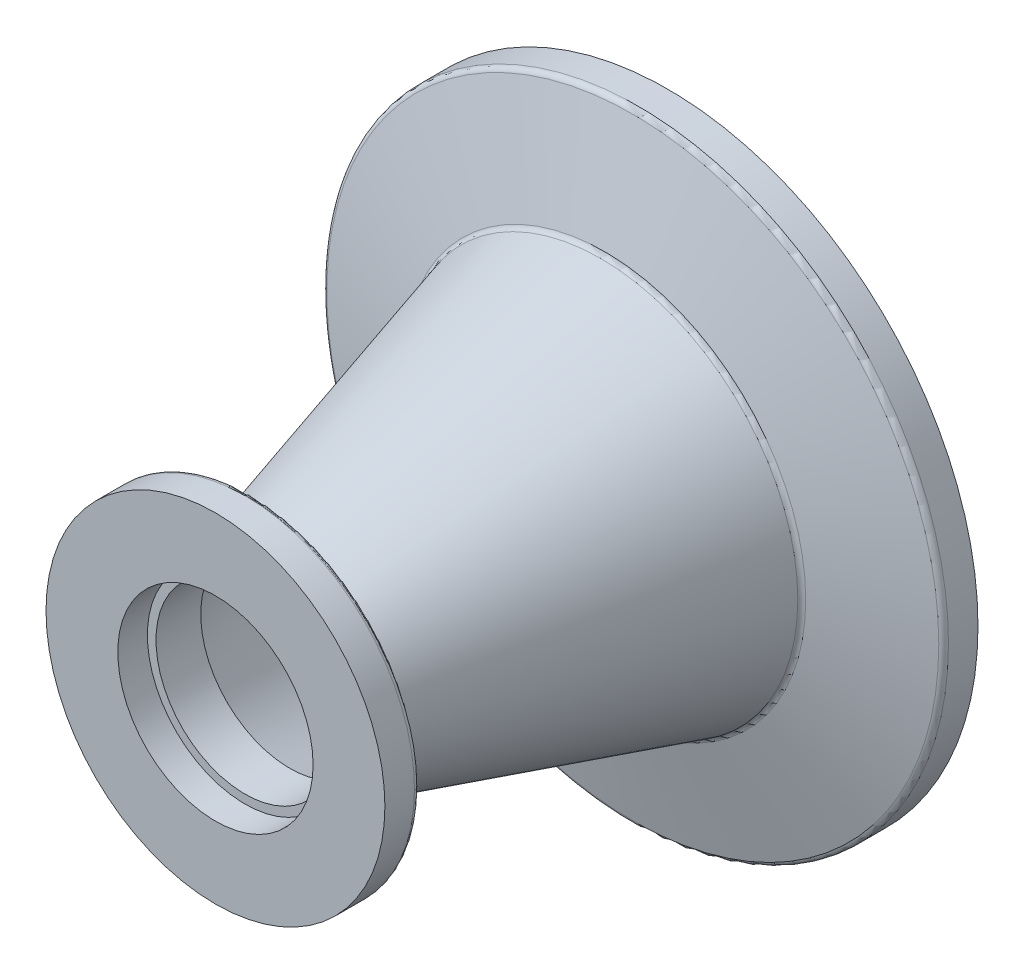
ISO-10303-21;
HEADER;
FILE_DESCRIPTION(('STEP AP214'),'2;1');
FILE_NAME('part.step','',(''),(''),'','','');
FILE_SCHEMA(('AUTOMOTIVE_DESIGN { 1 0 10303 214 1 1 1 1 }'));
ENDSEC;
DATA;
#1=APPLICATION_CONTEXT('core data for automotive mechanical design processes');
#2=APPLICATION_PROTOCOL_DEFINITION('international standard','automotive_design',2000,#1);
#3=PRODUCT_CONTEXT('',#1,'mechanical');
#4=PRODUCT('Part','Part','',(#3));
#5=PRODUCT_RELATED_PRODUCT_CATEGORY('part','',(#4));
#6=PRODUCT_DEFINITION_FORMATION('','',#4);
#7=PRODUCT_DEFINITION_CONTEXT('part definition',#1,'design');
#8=PRODUCT_DEFINITION('design','',#6,#7);
#9=PRODUCT_DEFINITION_SHAPE('','',#8);
#10=(LENGTH_UNIT() NAMED_UNIT(*) SI_UNIT(.MILLI.,.METRE.));
#11=(NAMED_UNIT(*) PLANE_ANGLE_UNIT() SI_UNIT($,.RADIAN.));
#12=(NAMED_UNIT(*) SI_UNIT($,.STERADIAN.) SOLID_ANGLE_UNIT());
#13=UNCERTAINTY_MEASURE_WITH_UNIT(LENGTH_MEASURE(1.E-05),#10,'distance_accuracy_value','');
#14=(GEOMETRIC_REPRESENTATION_CONTEXT(3) GLOBAL_UNCERTAINTY_ASSIGNED_CONTEXT((#13)) GLOBAL_UNIT_ASSIGNED_CONTEXT((#10,
#11,#12)) REPRESENTATION_CONTEXT('',''));
#15=CARTESIAN_POINT('',(0.,0.,0.));
#16=DIRECTION('',(0.,0.,1.));
#17=DIRECTION('',(1.,0.,0.));
#18=AXIS2_PLACEMENT_3D('',#15,#16,#17);
#19=CARTESIAN_POINT('',(0.,20.6502,-20.0025));
#20=DIRECTION('',(0.,0.,1.));
#21=DIRECTION('',(1.,0.,0.));
#22=AXIS2_PLACEMENT_3D('',#19,#20,#21);
#23=PLANE('',#22);
#24=CARTESIAN_POINT('',(0.,0.,-20.0025));
#25=DIRECTION('',(0.,0.,1.));
#26=DIRECTION('',(1.,0.,0.));
#27=AXIS2_PLACEMENT_3D('',#24,#25,#26);
#28=CIRCLE('',#27,27.432);
#29=CARTESIAN_POINT('',(27.432,0.,-20.0025));
#30=VERTEX_POINT('',#29);
#31=EDGE_CURVE('E10',#30,#30,#28,.T.);
#32=ORIENTED_EDGE('',*,*,#31,.F.);
#33=EDGE_LOOP('',(#32));
#34=FACE_BOUND('',#33,.T.);
#35=CARTESIAN_POINT('',(0.,0.,-20.0025));
#36=DIRECTION('',(0.,0.,1.));
#37=DIRECTION('',(1.,0.,0.));
#38=AXIS2_PLACEMENT_3D('',#35,#36,#37);
#39=CIRCLE('',#38,20.6502);
#40=CARTESIAN_POINT('',(20.6502,0.,-20.0025));
#41=VERTEX_POINT('',#40);
#42=EDGE_CURVE('E112',#41,#41,#39,.T.);
#43=ORIENTED_EDGE('',*,*,#42,.T.);
#44=EDGE_LOOP('',(#43));
#45=FACE_BOUND('',#44,.T.);
#46=ADVANCED_FACE('F39',(#34,#45),#23,.F.);
#47=CARTESIAN_POINT('',(0.,0.,20.0025));
#48=DIRECTION('',(0.,0.,1.));
#49=DIRECTION('',(1.,0.,0.));
#50=AXIS2_PLACEMENT_3D('',#47,#48,#49);
#51=CYLINDRICAL_SURFACE('',#50,27.432);
#52=CARTESIAN_POINT('',(0.,0.,-17.3889634939895));
#53=DIRECTION('',(0.,0.,1.));
#54=DIRECTION('',(1.,0.,0.));
#55=AXIS2_PLACEMENT_3D('',#52,#53,#54);
#56=CIRCLE('',#55,27.432);
#57=CARTESIAN_POINT('',(27.432,0.,-17.3889634939895));
#58=VERTEX_POINT('',#57);
#59=EDGE_CURVE('E46',#58,#58,#56,.T.);
#60=ORIENTED_EDGE('',*,*,#59,.F.);
#61=EDGE_LOOP('',(#60));
#62=FACE_BOUND('',#61,.T.);
#63=ORIENTED_EDGE('',*,*,#31,.T.);
#64=EDGE_LOOP('',(#63));
#65=FACE_BOUND('',#64,.T.);
#66=ADVANCED_FACE('F205',(#62,#65),#51,.T.);
#67=CARTESIAN_POINT('',(0.,0.,-17.3889634939895));
#68=DIRECTION('',(0.,0.,1.));
#69=DIRECTION('',(1.,0.,0.));
#70=AXIS2_PLACEMENT_3D('',#67,#68,#69);
#71=TOROIDAL_SURFACE('',#70,26.932,0.499999999999999);
#72=CARTESIAN_POINT('',(0.,0.,-16.906000580845));
#73=DIRECTION('',(0.,0.,1.));
#74=DIRECTION('',(1.,0.,0.));
#75=AXIS2_PLACEMENT_3D('',#72,#73,#74);
#76=CIRCLE('',#75,27.0614095225513);
#77=CARTESIAN_POINT('',(27.0614095225513,0.,-16.906000580845));
#78=VERTEX_POINT('',#77);
#79=EDGE_CURVE('E52',#78,#78,#76,.T.);
#80=ORIENTED_EDGE('',*,*,#79,.F.);
#81=EDGE_LOOP('',(#80));
#82=FACE_BOUND('',#81,.T.);
#83=ORIENTED_EDGE('',*,*,#59,.T.);
#84=EDGE_LOOP('',(#83));
#85=FACE_BOUND('',#84,.T.);
#86=ADVANCED_FACE('F200',(#82,#85),#71,.T.);
#87=CARTESIAN_POINT('',(0.,0.,-16.906000580845));
#88=DIRECTION('',(0.,0.,-1.));
#89=DIRECTION('',(-1.,0.,0.));
#90=AXIS2_PLACEMENT_3D('',#87,#88,#89);
#91=CONICAL_SURFACE('',#90,27.0614095225513,1.30899693899575);
#92=CARTESIAN_POINT('',(0.,0.,-14.4184448474623));
#93=DIRECTION('',(0.,0.,1.));
#94=DIRECTION('',(1.,0.,0.));
#95=AXIS2_PLACEMENT_3D('',#92,#93,#94);
#96=CIRCLE('',#95,17.777725138908);
#97=CARTESIAN_POINT('',(17.777725138908,0.,-14.4184448474623));
#98=VERTEX_POINT('',#97);
#99=EDGE_CURVE('E58',#98,#98,#96,.T.);
#100=ORIENTED_EDGE('',*,*,#99,.F.);
#101=EDGE_LOOP('',(#100));
#102=FACE_BOUND('',#101,.T.);
#103=ORIENTED_EDGE('',*,*,#79,.T.);
#104=EDGE_LOOP('',(#103));
#105=FACE_BOUND('',#104,.T.);
#106=ADVANCED_FACE('F194',(#102,#105),#91,.T.);
#107=CARTESIAN_POINT('',(0.,0.,-13.9354819343178));
#108=DIRECTION('',(0.,0.,1.));
#109=DIRECTION('',(1.,0.,0.));
#110=AXIS2_PLACEMENT_3D('',#107,#108,#109);
#111=TOROIDAL_SURFACE('',#110,17.9071346614592,0.499999999999998);
#112=CARTESIAN_POINT('',(0.,0.,-14.0724776165905));
#113=DIRECTION('',(0.,0.,1.));
#114=DIRECTION('',(1.,0.,0.));
#115=AXIS2_PLACEMENT_3D('',#112,#113,#114);
#116=CIRCLE('',#115,17.4262685854686);
#117=CARTESIAN_POINT('',(17.4262685854686,0.,-14.0724776165905));
#118=VERTEX_POINT('',#117);
#119=EDGE_CURVE('E64',#118,#118,#116,.T.);
#120=ORIENTED_EDGE('',*,*,#119,.F.);
#121=EDGE_LOOP('',(#120));
#122=FACE_BOUND('',#121,.T.);
#123=ORIENTED_EDGE('',*,*,#99,.T.);
#124=EDGE_LOOP('',(#123));
#125=FACE_BOUND('',#124,.T.);
#126=ADVANCED_FACE('F188',(#122,#125),#111,.F.);
#127=CARTESIAN_POINT('',(0.,0.,-14.0724776165905));
#128=DIRECTION('',(0.,0.,-1.));
#129=DIRECTION('',(-1.,0.,0.));
#130=AXIS2_PLACEMENT_3D('',#127,#128,#129);
#131=CONICAL_SURFACE('',#130,17.4262685854686,0.277540775862109);
#132=CARTESIAN_POINT('',(0.,0.,14.9201696562838));
#133=DIRECTION('',(0.,0.,1.));
#134=DIRECTION('',(1.,0.,0.));
#135=AXIS2_PLACEMENT_3D('',#132,#133,#134);
#136=CIRCLE('',#135,9.16644804009442);
#137=CARTESIAN_POINT('',(9.16644804009442,0.,14.9201696562838));
#138=VERTEX_POINT('',#137);
#139=EDGE_CURVE('E68',#138,#138,#136,.T.);
#140=ORIENTED_EDGE('',*,*,#139,.F.);
#141=EDGE_LOOP('',(#140));
#142=FACE_BOUND('',#141,.T.);
#143=ORIENTED_EDGE('',*,*,#119,.T.);
#144=EDGE_LOOP('',(#143));
#145=FACE_BOUND('',#144,.T.);
#146=ADVANCED_FACE('F182',(#142,#145),#131,.T.);
#147=CARTESIAN_POINT('',(0.,0.,15.0571653385565));
#148=DIRECTION('',(0.,0.,1.));
#149=DIRECTION('',(1.,0.,0.));
#150=AXIS2_PLACEMENT_3D('',#147,#148,#149);
#151=TOROIDAL_SURFACE('',#150,9.64731411608504,0.5);
#152=CARTESIAN_POINT('',(0.,0.,15.5401282517011));
#153=DIRECTION('',(0.,0.,1.));
#154=DIRECTION('',(1.,0.,0.));
#155=AXIS2_PLACEMENT_3D('',#152,#153,#154);
#156=CIRCLE('',#155,9.51790459353379);
#157=CARTESIAN_POINT('',(9.51790459353379,0.,15.5401282517011));
#158=VERTEX_POINT('',#157);
#159=EDGE_CURVE('E72',#158,#158,#156,.T.);
#160=ORIENTED_EDGE('',*,*,#159,.F.);
#161=EDGE_LOOP('',(#160));
#162=FACE_BOUND('',#161,.T.);
#163=ORIENTED_EDGE('',*,*,#139,.T.);
#164=EDGE_LOOP('',(#163));
#165=FACE_BOUND('',#164,.T.);
#166=ADVANCED_FACE('F176',(#162,#165),#151,.F.);
#167=CARTESIAN_POINT('',(0.,0.,15.5401282517011));
#168=DIRECTION('',(0.,0.,1.));
#169=DIRECTION('',(1.,0.,0.));
#170=AXIS2_PLACEMENT_3D('',#167,#168,#169);
#171=CONICAL_SURFACE('',#170,9.51790459353379,1.30899693899575);
#172=CARTESIAN_POINT('',(0.,0.,16.9060005808449));
#173=DIRECTION('',(0.,0.,1.));
#174=DIRECTION('',(1.,0.,0.));
#175=AXIS2_PLACEMENT_3D('',#172,#173,#174);
#176=CIRCLE('',#175,14.6154095225513);
#177=CARTESIAN_POINT('',(14.6154095225513,0.,16.9060005808449));
#178=VERTEX_POINT('',#177);
#179=EDGE_CURVE('E76',#178,#178,#176,.T.);
#180=ORIENTED_EDGE('',*,*,#179,.F.);
#181=EDGE_LOOP('',(#180));
#182=FACE_BOUND('',#181,.T.);
#183=ORIENTED_EDGE('',*,*,#159,.T.);
#184=EDGE_LOOP('',(#183));
#185=FACE_BOUND('',#184,.T.);
#186=ADVANCED_FACE('F170',(#182,#185),#171,.T.);
#187=CARTESIAN_POINT('',(0.,0.,17.3889634939895));
#188=DIRECTION('',(0.,0.,1.));
#189=DIRECTION('',(1.,0.,0.));
#190=AXIS2_PLACEMENT_3D('',#187,#188,#189);
#191=TOROIDAL_SURFACE('',#190,14.486,0.500000000000002);
#192=CARTESIAN_POINT('',(0.,0.,17.3889634939895));
#193=DIRECTION('',(0.,0.,1.));
#194=DIRECTION('',(1.,0.,0.));
#195=AXIS2_PLACEMENT_3D('',#192,#193,#194);
#196=CIRCLE('',#195,14.986);
#197=CARTESIAN_POINT('',(14.986,0.,17.3889634939895));
#198=VERTEX_POINT('',#197);
#199=EDGE_CURVE('E80',#198,#198,#196,.T.);
#200=ORIENTED_EDGE('',*,*,#199,.F.);
#201=EDGE_LOOP('',(#200));
#202=FACE_BOUND('',#201,.T.);
#203=ORIENTED_EDGE('',*,*,#179,.T.);
#204=EDGE_LOOP('',(#203));
#205=FACE_BOUND('',#204,.T.);
#206=ADVANCED_FACE('F164',(#202,#205),#191,.T.);
#207=CARTESIAN_POINT('',(0.,0.,20.0025));
#208=DIRECTION('',(0.,0.,1.));
#209=DIRECTION('',(1.,0.,0.));
#210=AXIS2_PLACEMENT_3D('',#207,#208,#209);
#211=CYLINDRICAL_SURFACE('',#210,14.986);
#212=CARTESIAN_POINT('',(0.,0.,20.0025));
#213=DIRECTION('',(0.,0.,1.));
#214=DIRECTION('',(1.,0.,0.));
#215=AXIS2_PLACEMENT_3D('',#212,#213,#214);
#216=CIRCLE('',#215,14.986);
#217=CARTESIAN_POINT('',(14.986,0.,20.0025));
#218=VERTEX_POINT('',#217);
#219=EDGE_CURVE('E84',#218,#218,#216,.T.);
#220=ORIENTED_EDGE('',*,*,#219,.F.);
#221=EDGE_LOOP('',(#220));
#222=FACE_BOUND('',#221,.T.);
#223=ORIENTED_EDGE('',*,*,#199,.T.);
#224=EDGE_LOOP('',(#223));
#225=FACE_BOUND('',#224,.T.);
#226=ADVANCED_FACE('F158',(#222,#225),#211,.T.);
#227=CARTESIAN_POINT('',(0.,8.636,20.0025));
#228=DIRECTION('',(0.,0.,-1.));
#229=DIRECTION('',(-1.,0.,0.));
#230=AXIS2_PLACEMENT_3D('',#227,#228,#229);
#231=PLANE('',#230);
#232=CARTESIAN_POINT('',(0.,0.,20.0025));
#233=DIRECTION('',(0.,0.,1.));
#234=DIRECTION('',(1.,0.,0.));
#235=AXIS2_PLACEMENT_3D('',#232,#233,#234);
#236=CIRCLE('',#235,8.636);
#237=CARTESIAN_POINT('',(8.636,0.,20.0025));
#238=VERTEX_POINT('',#237);
#239=EDGE_CURVE('E88',#238,#238,#236,.T.);
#240=ORIENTED_EDGE('',*,*,#239,.F.);
#241=EDGE_LOOP('',(#240));
#242=FACE_BOUND('',#241,.T.);
#243=ORIENTED_EDGE('',*,*,#219,.T.);
#244=EDGE_LOOP('',(#243));
#245=FACE_BOUND('',#244,.T.);
#246=ADVANCED_FACE('F152',(#242,#245),#231,.F.);
#247=CARTESIAN_POINT('',(0.,0.,20.0025));
#248=DIRECTION('',(0.,0.,1.));
#249=DIRECTION('',(1.,0.,0.));
#250=AXIS2_PLACEMENT_3D('',#247,#248,#249);
#251=CYLINDRICAL_SURFACE('',#250,8.636);
#252=CARTESIAN_POINT('',(0.,0.,17.3863));
#253=DIRECTION('',(0.,0.,1.));
#254=DIRECTION('',(1.,0.,0.));
#255=AXIS2_PLACEMENT_3D('',#252,#253,#254);
#256=CIRCLE('',#255,8.636);
#257=CARTESIAN_POINT('',(8.636,0.,17.3863));
#258=VERTEX_POINT('',#257);
#259=EDGE_CURVE('E92',#258,#258,#256,.T.);
#260=ORIENTED_EDGE('',*,*,#259,.F.);
#261=EDGE_LOOP('',(#260));
#262=FACE_BOUND('',#261,.T.);
#263=ORIENTED_EDGE('',*,*,#239,.T.);
#264=EDGE_LOOP('',(#263));
#265=FACE_BOUND('',#264,.T.);
#266=ADVANCED_FACE('F146',(#262,#265),#251,.F.);
#267=CARTESIAN_POINT('',(0.,8.636,17.3863));
#268=DIRECTION('',(0.,0.,-1.));
#269=DIRECTION('',(-1.,0.,0.));
#270=AXIS2_PLACEMENT_3D('',#267,#268,#269);
#271=PLANE('',#270);
#272=CARTESIAN_POINT('',(0.,0.,17.3863));
#273=DIRECTION('',(0.,0.,1.));
#274=DIRECTION('',(1.,0.,0.));
#275=AXIS2_PLACEMENT_3D('',#272,#273,#274);
#276=CIRCLE('',#275,7.874);
#277=CARTESIAN_POINT('',(7.874,0.,17.3863));
#278=VERTEX_POINT('',#277);
#279=EDGE_CURVE('E96',#278,#278,#276,.T.);
#280=ORIENTED_EDGE('',*,*,#279,.F.);
#281=EDGE_LOOP('',(#280));
#282=FACE_BOUND('',#281,.T.);
#283=ORIENTED_EDGE('',*,*,#259,.T.);
#284=EDGE_LOOP('',(#283));
#285=FACE_BOUND('',#284,.T.);
#286=ADVANCED_FACE('F140',(#282,#285),#271,.F.);
#287=CARTESIAN_POINT('',(0.,0.,20.0025));
#288=DIRECTION('',(0.,0.,1.));
#289=DIRECTION('',(1.,0.,0.));
#290=AXIS2_PLACEMENT_3D('',#287,#288,#289);
#291=CYLINDRICAL_SURFACE('',#290,7.874);
#292=CARTESIAN_POINT('',(0.,0.,13.4310308808598));
#293=DIRECTION('',(0.,0.,1.));
#294=DIRECTION('',(1.,0.,0.));
#295=AXIS2_PLACEMENT_3D('',#292,#293,#294);
#296=CIRCLE('',#295,7.874);
#297=CARTESIAN_POINT('',(7.874,0.,13.4310308808598));
#298=VERTEX_POINT('',#297);
#299=EDGE_CURVE('E100',#298,#298,#296,.T.);
#300=ORIENTED_EDGE('',*,*,#299,.F.);
#301=EDGE_LOOP('',(#300));
#302=FACE_BOUND('',#301,.T.);
#303=ORIENTED_EDGE('',*,*,#279,.T.);
#304=EDGE_LOOP('',(#303));
#305=FACE_BOUND('',#304,.T.);
#306=ADVANCED_FACE('F134',(#302,#305),#291,.F.);
#307=CARTESIAN_POINT('',(0.,0.,13.4310308808598));
#308=DIRECTION('',(0.,0.,-1.));
#309=DIRECTION('',(-1.,0.,0.));
#310=AXIS2_PLACEMENT_3D('',#307,#308,#309);
#311=CONICAL_SURFACE('',#310,7.874,0.277540775862109);
#312=CARTESIAN_POINT('',(0.,0.,-17.3863));
#313=DIRECTION('',(0.,0.,1.));
#314=DIRECTION('',(1.,0.,0.));
#315=AXIS2_PLACEMENT_3D('',#312,#313,#314);
#316=CIRCLE('',#315,16.6536612833446);
#317=CARTESIAN_POINT('',(16.6536612833446,0.,-17.3863));
#318=VERTEX_POINT('',#317);
#319=EDGE_CURVE('E104',#318,#318,#316,.T.);
#320=ORIENTED_EDGE('',*,*,#319,.F.);
#321=EDGE_LOOP('',(#320));
#322=FACE_BOUND('',#321,.T.);
#323=ORIENTED_EDGE('',*,*,#299,.T.);
#324=EDGE_LOOP('',(#323));
#325=FACE_BOUND('',#324,.T.);
#326=ADVANCED_FACE('F128',(#322,#325),#311,.F.);
#327=CARTESIAN_POINT('',(0.,16.6536612833446,-17.3863));
#328=DIRECTION('',(0.,0.,1.));
#329=DIRECTION('',(1.,0.,0.));
#330=AXIS2_PLACEMENT_3D('',#327,#328,#329);
#331=PLANE('',#330);
#332=CARTESIAN_POINT('',(0.,0.,-17.3863));
#333=DIRECTION('',(0.,0.,1.));
#334=DIRECTION('',(1.,0.,0.));
#335=AXIS2_PLACEMENT_3D('',#332,#333,#334);
#336=CIRCLE('',#335,20.6502);
#337=CARTESIAN_POINT('',(20.6502,0.,-17.3863));
#338=VERTEX_POINT('',#337);
#339=EDGE_CURVE('E108',#338,#338,#336,.T.);
#340=ORIENTED_EDGE('',*,*,#339,.F.);
#341=EDGE_LOOP('',(#340));
#342=FACE_BOUND('',#341,.T.);
#343=ORIENTED_EDGE('',*,*,#319,.T.);
#344=EDGE_LOOP('',(#343));
#345=FACE_BOUND('',#344,.T.);
#346=ADVANCED_FACE('F122',(#342,#345),#331,.F.);
#347=CARTESIAN_POINT('',(0.,0.,20.0025));
#348=DIRECTION('',(0.,0.,1.));
#349=DIRECTION('',(1.,0.,0.));
#350=AXIS2_PLACEMENT_3D('',#347,#348,#349);
#351=CYLINDRICAL_SURFACE('',#350,20.6502);
#352=ORIENTED_EDGE('',*,*,#42,.F.);
#353=EDGE_LOOP('',(#352));
#354=FACE_BOUND('',#353,.T.);
#355=ORIENTED_EDGE('',*,*,#339,.T.);
#356=EDGE_LOOP('',(#355));
#357=FACE_BOUND('',#356,.T.);
#358=ADVANCED_FACE('F119',(#354,#357),#351,.F.);
#359=CLOSED_SHELL('',(#46,#66,#86,#106,#126,#146,#166,#186,#206,#226,#246,#266,#286,#306,#326,
#346,#358));
#360=MANIFOLD_SOLID_BREP('B2',#359);
#361=ADVANCED_BREP_SHAPE_REPRESENTATION('',(#18,#360),#14);
#362=SHAPE_DEFINITION_REPRESENTATION(#9,#361);
ENDSEC;
END-ISO-10303-21;
